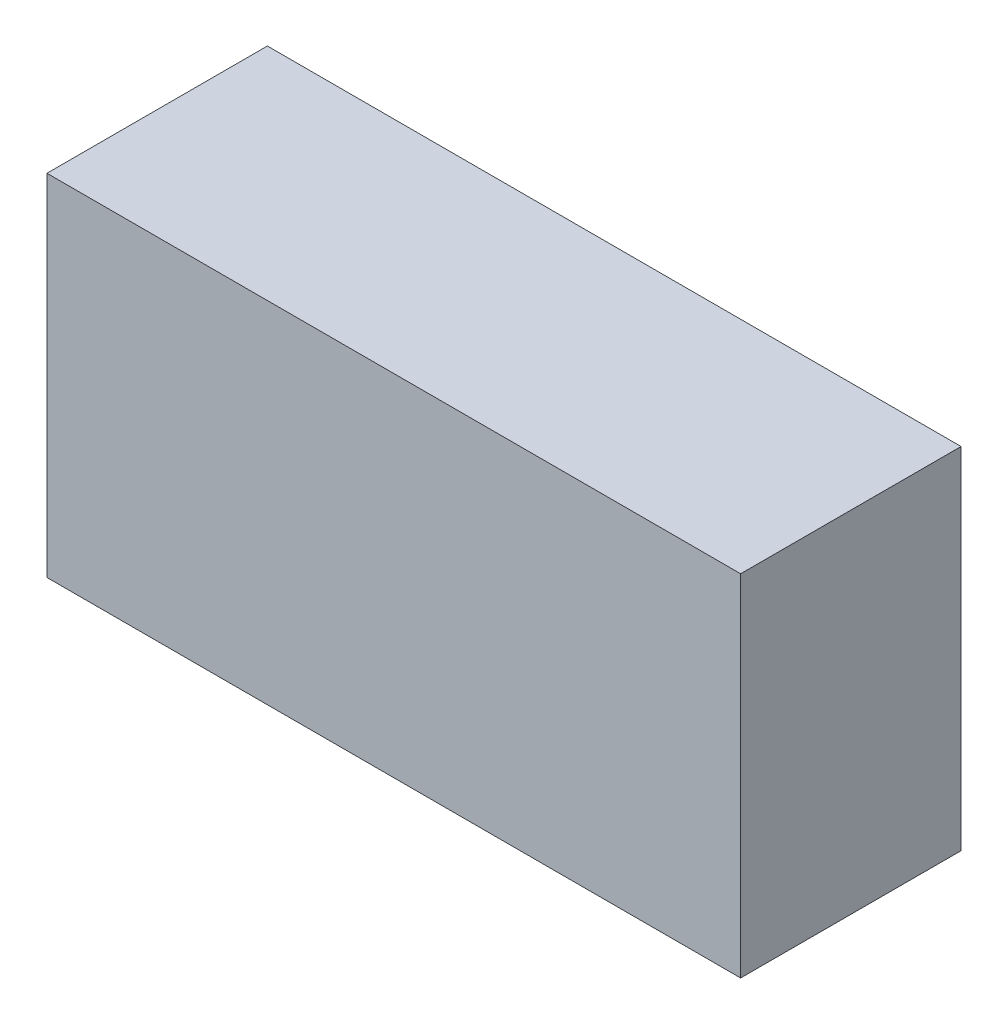
ISO-10303-21;
HEADER;
FILE_DESCRIPTION(('STEP AP214'),'2;1');
FILE_NAME('part.step','',(''),(''),'','','');
FILE_SCHEMA(('AUTOMOTIVE_DESIGN { 1 0 10303 214 1 1 1 1 }'));
ENDSEC;
DATA;
#1=APPLICATION_CONTEXT('core data for automotive mechanical design processes');
#2=APPLICATION_PROTOCOL_DEFINITION('international standard','automotive_design',2000,#1);
#3=PRODUCT_CONTEXT('',#1,'mechanical');
#4=PRODUCT('Part','Part','',(#3));
#5=PRODUCT_RELATED_PRODUCT_CATEGORY('part','',(#4));
#6=PRODUCT_DEFINITION_FORMATION('','',#4);
#7=PRODUCT_DEFINITION_CONTEXT('part definition',#1,'design');
#8=PRODUCT_DEFINITION('design','',#6,#7);
#9=PRODUCT_DEFINITION_SHAPE('','',#8);
#10=(LENGTH_UNIT() NAMED_UNIT(*) SI_UNIT(.MILLI.,.METRE.));
#11=(NAMED_UNIT(*) PLANE_ANGLE_UNIT() SI_UNIT($,.RADIAN.));
#12=(NAMED_UNIT(*) SI_UNIT($,.STERADIAN.) SOLID_ANGLE_UNIT());
#13=UNCERTAINTY_MEASURE_WITH_UNIT(LENGTH_MEASURE(1.E-05),#10,'distance_accuracy_value','');
#14=(GEOMETRIC_REPRESENTATION_CONTEXT(3) GLOBAL_UNCERTAINTY_ASSIGNED_CONTEXT((#13)) GLOBAL_UNIT_ASSIGNED_CONTEXT((#10,
#11,#12)) REPRESENTATION_CONTEXT('',''));
#15=CARTESIAN_POINT('',(0.,0.,0.));
#16=DIRECTION('',(0.,0.,1.));
#17=DIRECTION('',(1.,0.,0.));
#18=AXIS2_PLACEMENT_3D('',#15,#16,#17);
#19=CARTESIAN_POINT('',(26.75,27.,8.5));
#20=DIRECTION('',(-1.,0.,0.));
#21=DIRECTION('',(0.,0.,1.));
#22=AXIS2_PLACEMENT_3D('',#19,#20,#21);
#23=PLANE('',#22);
#24=DIRECTION('',(0.,0.,-1.));
#25=VECTOR('',#24,1.);
#26=CARTESIAN_POINT('',(26.75,0.,8.5));
#27=LINE('',#26,#25);
#28=CARTESIAN_POINT('',(26.75,0.,8.5));
#29=VERTEX_POINT('',#28);
#30=CARTESIAN_POINT('',(26.75,0.,-8.5));
#31=VERTEX_POINT('',#30);
#32=EDGE_CURVE('E102',#29,#31,#27,.T.);
#33=ORIENTED_EDGE('',*,*,#32,.T.);
#34=DIRECTION('',(0.,-1.,0.));
#35=VECTOR('',#34,1.);
#36=CARTESIAN_POINT('',(26.75,27.,-8.5));
#37=LINE('',#36,#35);
#38=CARTESIAN_POINT('',(26.75,27.,-8.5));
#39=VERTEX_POINT('',#38);
#40=EDGE_CURVE('E11',#39,#31,#37,.T.);
#41=ORIENTED_EDGE('',*,*,#40,.F.);
#42=DIRECTION('',(0.,0.,-1.));
#43=VECTOR('',#42,1.);
#44=CARTESIAN_POINT('',(26.75,27.,8.5));
#45=LINE('',#44,#43);
#46=CARTESIAN_POINT('',(26.75,27.,8.5));
#47=VERTEX_POINT('',#46);
#48=EDGE_CURVE('E90',#47,#39,#45,.T.);
#49=ORIENTED_EDGE('',*,*,#48,.F.);
#50=DIRECTION('',(0.,-1.,0.));
#51=VECTOR('',#50,1.);
#52=CARTESIAN_POINT('',(26.75,27.,8.5));
#53=LINE('',#52,#51);
#54=EDGE_CURVE('E98',#47,#29,#53,.T.);
#55=ORIENTED_EDGE('',*,*,#54,.T.);
#56=EDGE_LOOP('',(#33,#41,#49,#55));
#57=FACE_BOUND('',#56,.T.);
#58=ADVANCED_FACE('F39',(#57),#23,.F.);
#59=CARTESIAN_POINT('',(-26.75,27.,-8.5));
#60=DIRECTION('',(0.,0.,1.));
#61=DIRECTION('',(1.,0.,0.));
#62=AXIS2_PLACEMENT_3D('',#59,#60,#61);
#63=PLANE('',#62);
#64=DIRECTION('',(-1.,0.,0.));
#65=VECTOR('',#64,1.);
#66=CARTESIAN_POINT('',(-26.75,0.,-8.5));
#67=LINE('',#66,#65);
#68=CARTESIAN_POINT('',(-26.75,0.,-8.5));
#69=VERTEX_POINT('',#68);
#70=EDGE_CURVE('E94',#31,#69,#67,.T.);
#71=ORIENTED_EDGE('',*,*,#70,.T.);
#72=DIRECTION('',(0.,-1.,0.));
#73=VECTOR('',#72,1.);
#74=CARTESIAN_POINT('',(-26.75,27.,-8.5));
#75=LINE('',#74,#73);
#76=CARTESIAN_POINT('',(-26.75,27.,-8.5));
#77=VERTEX_POINT('',#76);
#78=EDGE_CURVE('E47',#77,#69,#75,.T.);
#79=ORIENTED_EDGE('',*,*,#78,.F.);
#80=DIRECTION('',(-1.,0.,0.));
#81=VECTOR('',#80,1.);
#82=CARTESIAN_POINT('',(-26.75,27.,-8.5));
#83=LINE('',#82,#81);
#84=EDGE_CURVE('E85',#39,#77,#83,.T.);
#85=ORIENTED_EDGE('',*,*,#84,.F.);
#86=ORIENTED_EDGE('',*,*,#40,.T.);
#87=EDGE_LOOP('',(#71,#79,#85,#86));
#88=FACE_BOUND('',#87,.T.);
#89=ADVANCED_FACE('F93',(#88),#63,.F.);
#90=CARTESIAN_POINT('',(-26.75,27.,8.5));
#91=DIRECTION('',(1.,0.,0.));
#92=DIRECTION('',(0.,0.,-1.));
#93=AXIS2_PLACEMENT_3D('',#90,#91,#92);
#94=PLANE('',#93);
#95=DIRECTION('',(0.,0.,1.));
#96=VECTOR('',#95,1.);
#97=CARTESIAN_POINT('',(-26.75,0.,8.5));
#98=LINE('',#97,#96);
#99=CARTESIAN_POINT('',(-26.75,0.,8.5));
#100=VERTEX_POINT('',#99);
#101=EDGE_CURVE('E72',#69,#100,#98,.T.);
#102=ORIENTED_EDGE('',*,*,#101,.T.);
#103=DIRECTION('',(0.,-1.,0.));
#104=VECTOR('',#103,1.);
#105=CARTESIAN_POINT('',(-26.75,27.,8.5));
#106=LINE('',#105,#104);
#107=CARTESIAN_POINT('',(-26.75,27.,8.5));
#108=VERTEX_POINT('',#107);
#109=EDGE_CURVE('E95',#108,#100,#106,.T.);
#110=ORIENTED_EDGE('',*,*,#109,.F.);
#111=DIRECTION('',(0.,0.,1.));
#112=VECTOR('',#111,1.);
#113=CARTESIAN_POINT('',(-26.75,27.,8.5));
#114=LINE('',#113,#112);
#115=EDGE_CURVE('E88',#77,#108,#114,.T.);
#116=ORIENTED_EDGE('',*,*,#115,.F.);
#117=ORIENTED_EDGE('',*,*,#78,.T.);
#118=EDGE_LOOP('',(#102,#110,#116,#117));
#119=FACE_BOUND('',#118,.T.);
#120=ADVANCED_FACE('F96',(#119),#94,.F.);
#121=CARTESIAN_POINT('',(-26.75,27.,8.5));
#122=DIRECTION('',(0.,0.,-1.));
#123=DIRECTION('',(-1.,0.,0.));
#124=AXIS2_PLACEMENT_3D('',#121,#122,#123);
#125=PLANE('',#124);
#126=DIRECTION('',(1.,0.,0.));
#127=VECTOR('',#126,1.);
#128=CARTESIAN_POINT('',(-26.75,0.,8.5));
#129=LINE('',#128,#127);
#130=EDGE_CURVE('E78',#100,#29,#129,.T.);
#131=ORIENTED_EDGE('',*,*,#130,.T.);
#132=ORIENTED_EDGE('',*,*,#54,.F.);
#133=DIRECTION('',(1.,0.,0.));
#134=VECTOR('',#133,1.);
#135=CARTESIAN_POINT('',(-26.75,27.,8.5));
#136=LINE('',#135,#134);
#137=EDGE_CURVE('E55',#108,#47,#136,.T.);
#138=ORIENTED_EDGE('',*,*,#137,.F.);
#139=ORIENTED_EDGE('',*,*,#109,.T.);
#140=EDGE_LOOP('',(#131,#132,#138,#139));
#141=FACE_BOUND('',#140,.T.);
#142=ADVANCED_FACE('F109',(#141),#125,.F.);
#143=CARTESIAN_POINT('',(0.,27.,0.));
#144=DIRECTION('',(0.,-1.,0.));
#145=DIRECTION('',(0.,0.,-1.));
#146=AXIS2_PLACEMENT_3D('',#143,#144,#145);
#147=PLANE('',#146);
#148=ORIENTED_EDGE('',*,*,#48,.T.);
#149=ORIENTED_EDGE('',*,*,#84,.T.);
#150=ORIENTED_EDGE('',*,*,#115,.T.);
#151=ORIENTED_EDGE('',*,*,#137,.T.);
#152=EDGE_LOOP('',(#148,#149,#150,#151));
#153=FACE_BOUND('',#152,.T.);
#154=ADVANCED_FACE('F86',(#153),#147,.F.);
#155=CARTESIAN_POINT('',(0.,0.,0.));
#156=DIRECTION('',(0.,-1.,0.));
#157=DIRECTION('',(0.,0.,-1.));
#158=AXIS2_PLACEMENT_3D('',#155,#156,#157);
#159=PLANE('',#158);
#160=ORIENTED_EDGE('',*,*,#32,.F.);
#161=ORIENTED_EDGE('',*,*,#130,.F.);
#162=ORIENTED_EDGE('',*,*,#101,.F.);
#163=ORIENTED_EDGE('',*,*,#70,.F.);
#164=EDGE_LOOP('',(#160,#161,#162,#163));
#165=FACE_BOUND('',#164,.T.);
#166=ADVANCED_FACE('F112',(#165),#159,.T.);
#167=CLOSED_SHELL('',(#58,#89,#120,#142,#154,#166));
#168=MANIFOLD_SOLID_BREP('B2',#167);
#169=ADVANCED_BREP_SHAPE_REPRESENTATION('',(#18,#168),#14);
#170=SHAPE_DEFINITION_REPRESENTATION(#9,#169);
ENDSEC;
END-ISO-10303-21;
